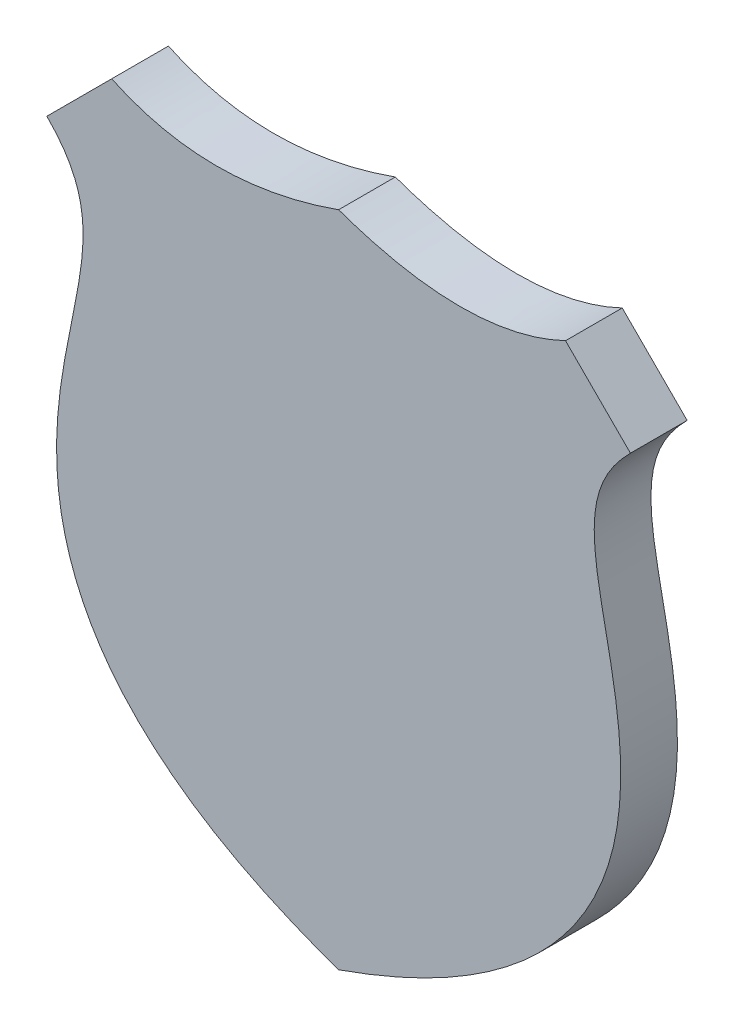
ISO-10303-21;
HEADER;
FILE_DESCRIPTION(('STEP AP214'),'2;1');
FILE_NAME('part.step','',(''),(''),'','','');
FILE_SCHEMA(('AUTOMOTIVE_DESIGN { 1 0 10303 214 1 1 1 1 }'));
ENDSEC;
DATA;
#1=APPLICATION_CONTEXT('core data for automotive mechanical design processes');
#2=APPLICATION_PROTOCOL_DEFINITION('international standard','automotive_design',2000,#1);
#3=PRODUCT_CONTEXT('',#1,'mechanical');
#4=PRODUCT('Part','Part','',(#3));
#5=PRODUCT_RELATED_PRODUCT_CATEGORY('part','',(#4));
#6=PRODUCT_DEFINITION_FORMATION('','',#4);
#7=PRODUCT_DEFINITION_CONTEXT('part definition',#1,'design');
#8=PRODUCT_DEFINITION('design','',#6,#7);
#9=PRODUCT_DEFINITION_SHAPE('','',#8);
#10=(LENGTH_UNIT() NAMED_UNIT(*) SI_UNIT(.MILLI.,.METRE.));
#11=(NAMED_UNIT(*) PLANE_ANGLE_UNIT() SI_UNIT($,.RADIAN.));
#12=(NAMED_UNIT(*) SI_UNIT($,.STERADIAN.) SOLID_ANGLE_UNIT());
#13=UNCERTAINTY_MEASURE_WITH_UNIT(LENGTH_MEASURE(1.E-05),#10,'distance_accuracy_value','');
#14=(GEOMETRIC_REPRESENTATION_CONTEXT(3) GLOBAL_UNCERTAINTY_ASSIGNED_CONTEXT((#13)) GLOBAL_UNIT_ASSIGNED_CONTEXT((#10,
#11,#12)) REPRESENTATION_CONTEXT('',''));
#15=CARTESIAN_POINT('',(0.,0.,0.));
#16=DIRECTION('',(0.,0.,1.));
#17=DIRECTION('',(1.,0.,0.));
#18=AXIS2_PLACEMENT_3D('',#15,#16,#17);
#19=CARTESIAN_POINT('',(25.4,0.,6.35));
#20=CARTESIAN_POINT('',(14.5422885866351,-5.18026315789474,6.35));
#21=CARTESIAN_POINT('',(0.,0.,6.35));
#22=B_SPLINE_CURVE_WITH_KNOTS('',2,(#19,#20,#21),.UNSPECIFIED.,.F.,.F.,(3,3),(0.,1.),.UNSPECIFIED.);
#23=DIRECTION('',(0.,0.,-1.));
#24=VECTOR('',#23,1.);
#25=SURFACE_OF_LINEAR_EXTRUSION('',#22,#24);
#26=CARTESIAN_POINT('',(25.4,0.,0.));
#27=CARTESIAN_POINT('',(14.5422885866351,-5.18026315789474,0.));
#28=CARTESIAN_POINT('',(0.,0.,0.));
#29=B_SPLINE_CURVE_WITH_KNOTS('',2,(#26,#27,#28),.UNSPECIFIED.,.F.,.F.,(3,3),(0.,1.),.UNSPECIFIED.);
#30=CARTESIAN_POINT('',(25.4,0.,0.));
#31=VERTEX_POINT('',#30);
#32=CARTESIAN_POINT('',(0.,0.,0.));
#33=VERTEX_POINT('',#32);
#34=EDGE_CURVE('E173',#31,#33,#29,.T.);
#35=ORIENTED_EDGE('',*,*,#34,.T.);
#36=DIRECTION('',(0.,0.,-1.));
#37=VECTOR('',#36,1.);
#38=CARTESIAN_POINT('',(0.,0.,6.35));
#39=LINE('',#38,#37);
#40=CARTESIAN_POINT('',(0.,0.,6.35));
#41=VERTEX_POINT('',#40);
#42=EDGE_CURVE('E11',#41,#33,#39,.T.);
#43=ORIENTED_EDGE('',*,*,#42,.F.);
#44=CARTESIAN_POINT('',(25.4,0.,6.35));
#45=VERTEX_POINT('',#44);
#46=EDGE_CURVE('E145',#45,#41,#22,.T.);
#47=ORIENTED_EDGE('',*,*,#46,.F.);
#48=DIRECTION('',(0.,0.,-1.));
#49=VECTOR('',#48,1.);
#50=CARTESIAN_POINT('',(25.4,0.,6.35));
#51=LINE('',#50,#49);
#52=EDGE_CURVE('E115',#45,#31,#51,.T.);
#53=ORIENTED_EDGE('',*,*,#52,.T.);
#54=EDGE_LOOP('',(#35,#43,#47,#53));
#55=FACE_BOUND('',#54,.T.);
#56=ADVANCED_FACE('F34',(#55),#25,.F.);
#57=CARTESIAN_POINT('',(0.,0.,6.35));
#58=CARTESIAN_POINT('',(-14.5422885866351,-5.18026315789474,6.35));
#59=CARTESIAN_POINT('',(-25.4,0.,6.35));
#60=B_SPLINE_CURVE_WITH_KNOTS('',2,(#57,#58,#59),.UNSPECIFIED.,.F.,.F.,(3,3),(0.,1.),.UNSPECIFIED.);
#61=DIRECTION('',(0.,0.,-1.));
#62=VECTOR('',#61,1.);
#63=SURFACE_OF_LINEAR_EXTRUSION('',#60,#62);
#64=CARTESIAN_POINT('',(0.,0.,0.));
#65=CARTESIAN_POINT('',(-14.5422885866351,-5.18026315789474,0.));
#66=CARTESIAN_POINT('',(-25.4,0.,0.));
#67=B_SPLINE_CURVE_WITH_KNOTS('',2,(#64,#65,#66),.UNSPECIFIED.,.F.,.F.,(3,3),(0.,1.),.UNSPECIFIED.);
#68=CARTESIAN_POINT('',(-25.4,0.,0.));
#69=VERTEX_POINT('',#68);
#70=EDGE_CURVE('E171',#33,#69,#67,.T.);
#71=ORIENTED_EDGE('',*,*,#70,.T.);
#72=DIRECTION('',(0.,0.,-1.));
#73=VECTOR('',#72,1.);
#74=CARTESIAN_POINT('',(-25.4,0.,6.35));
#75=LINE('',#74,#73);
#76=CARTESIAN_POINT('',(-25.4,0.,6.35));
#77=VERTEX_POINT('',#76);
#78=EDGE_CURVE('E43',#77,#69,#75,.T.);
#79=ORIENTED_EDGE('',*,*,#78,.F.);
#80=EDGE_CURVE('E88',#41,#77,#60,.T.);
#81=ORIENTED_EDGE('',*,*,#80,.F.);
#82=ORIENTED_EDGE('',*,*,#42,.T.);
#83=EDGE_LOOP('',(#71,#79,#81,#82));
#84=FACE_BOUND('',#83,.T.);
#85=ADVANCED_FACE('F138',(#84),#63,.F.);
#86=CARTESIAN_POINT('',(-25.4,0.,6.35));
#87=DIRECTION('',(0.707106781186548,-0.707106781186548,0.));
#88=DIRECTION('',(0.707106781186548,0.707106781186548,0.));
#89=AXIS2_PLACEMENT_3D('',#86,#87,#88);
#90=PLANE('',#89);
#91=DIRECTION('',(-0.707106781186548,-0.707106781186548,0.));
#92=VECTOR('',#91,1.);
#93=CARTESIAN_POINT('',(-25.4,0.,0.));
#94=LINE('',#93,#92);
#95=CARTESIAN_POINT('',(-32.6690789473684,-7.26907894736839,0.));
#96=VERTEX_POINT('',#95);
#97=EDGE_CURVE('E167',#69,#96,#94,.T.);
#98=ORIENTED_EDGE('',*,*,#97,.T.);
#99=DIRECTION('',(0.,0.,-1.));
#100=VECTOR('',#99,1.);
#101=CARTESIAN_POINT('',(-32.6690789473684,-7.26907894736839,6.35));
#102=LINE('',#101,#100);
#103=CARTESIAN_POINT('',(-32.6690789473684,-7.26907894736839,6.35));
#104=VERTEX_POINT('',#103);
#105=EDGE_CURVE('E110',#104,#96,#102,.T.);
#106=ORIENTED_EDGE('',*,*,#105,.F.);
#107=DIRECTION('',(-0.707106781186548,-0.707106781186548,0.));
#108=VECTOR('',#107,1.);
#109=CARTESIAN_POINT('',(-25.4,0.,6.35));
#110=LINE('',#109,#108);
#111=EDGE_CURVE('E101',#77,#104,#110,.T.);
#112=ORIENTED_EDGE('',*,*,#111,.F.);
#113=ORIENTED_EDGE('',*,*,#78,.T.);
#114=EDGE_LOOP('',(#98,#106,#112,#113));
#115=FACE_BOUND('',#114,.T.);
#116=ADVANCED_FACE('F136',(#115),#90,.F.);
#117=CARTESIAN_POINT('',(-32.6690789473684,-7.26907894736839,6.35));
#118=CARTESIAN_POINT('',(-22.6406978119456,-17.2974600827912,6.35));
#119=CARTESIAN_POINT('',(-30.5761324659965,-26.2355263157895,6.35));
#120=CARTESIAN_POINT('',(-43.9445535186281,-49.9644736842105,6.35));
#121=CARTESIAN_POINT('',(-23.8919219396807,-65.3381578947369,6.35));
#122=CARTESIAN_POINT('',(0.,-73.6934210526316,6.35));
#123=B_SPLINE_CURVE_WITH_KNOTS('',5,(#117,#118,#119,#120,#121,#122),.UNSPECIFIED.,.F.,.F.,(6,6),
(0.,1.),.UNSPECIFIED.);
#124=DIRECTION('',(0.,0.,-1.));
#125=VECTOR('',#124,1.);
#126=SURFACE_OF_LINEAR_EXTRUSION('',#123,#125);
#127=CARTESIAN_POINT('',(-32.6690789473684,-7.26907894736839,0.));
#128=CARTESIAN_POINT('',(-22.6406978119456,-17.2974600827912,0.));
#129=CARTESIAN_POINT('',(-30.5761324659965,-26.2355263157895,0.));
#130=CARTESIAN_POINT('',(-43.9445535186281,-49.9644736842105,0.));
#131=CARTESIAN_POINT('',(-23.8919219396807,-65.3381578947369,0.));
#132=CARTESIAN_POINT('',(0.,-73.6934210526316,0.));
#133=B_SPLINE_CURVE_WITH_KNOTS('',5,(#127,#128,#129,#130,#131,#132),.UNSPECIFIED.,.F.,.F.,(6,6),
(0.,1.),.UNSPECIFIED.);
#134=CARTESIAN_POINT('',(0.,-73.6934210526316,0.));
#135=VERTEX_POINT('',#134);
#136=EDGE_CURVE('E109',#96,#135,#133,.T.);
#137=ORIENTED_EDGE('',*,*,#136,.T.);
#138=DIRECTION('',(0.,0.,-1.));
#139=VECTOR('',#138,1.);
#140=CARTESIAN_POINT('',(0.,-73.6934210526316,6.35));
#141=LINE('',#140,#139);
#142=CARTESIAN_POINT('',(0.,-73.6934210526316,6.35));
#143=VERTEX_POINT('',#142);
#144=EDGE_CURVE('E106',#143,#135,#141,.T.);
#145=ORIENTED_EDGE('',*,*,#144,.F.);
#146=EDGE_CURVE('E95',#104,#143,#123,.T.);
#147=ORIENTED_EDGE('',*,*,#146,.F.);
#148=ORIENTED_EDGE('',*,*,#105,.T.);
#149=EDGE_LOOP('',(#137,#145,#147,#148));
#150=FACE_BOUND('',#149,.T.);
#151=ADVANCED_FACE('F107',(#150),#126,.F.);
#152=CARTESIAN_POINT('',(0.,-73.6934210526316,6.35));
#153=CARTESIAN_POINT('',(23.8919219396807,-65.3381578947369,6.35));
#154=CARTESIAN_POINT('',(43.9445535186281,-49.9644736842105,6.35));
#155=CARTESIAN_POINT('',(30.5761324659965,-26.2355263157895,6.35));
#156=CARTESIAN_POINT('',(22.6406978119456,-17.2974600827912,6.35));
#157=CARTESIAN_POINT('',(32.6690789473684,-7.26907894736839,6.35));
#158=B_SPLINE_CURVE_WITH_KNOTS('',5,(#152,#153,#154,#155,#156,#157),.UNSPECIFIED.,.F.,.F.,(6,6),
(0.,1.),.UNSPECIFIED.);
#159=DIRECTION('',(0.,0.,-1.));
#160=VECTOR('',#159,1.);
#161=SURFACE_OF_LINEAR_EXTRUSION('',#158,#160);
#162=CARTESIAN_POINT('',(0.,-73.6934210526316,0.));
#163=CARTESIAN_POINT('',(23.8919219396807,-65.3381578947369,0.));
#164=CARTESIAN_POINT('',(43.9445535186281,-49.9644736842105,0.));
#165=CARTESIAN_POINT('',(30.5761324659965,-26.2355263157895,0.));
#166=CARTESIAN_POINT('',(22.6406978119456,-17.2974600827912,0.));
#167=CARTESIAN_POINT('',(32.6690789473684,-7.26907894736839,0.));
#168=B_SPLINE_CURVE_WITH_KNOTS('',5,(#162,#163,#164,#165,#166,#167),.UNSPECIFIED.,.F.,.F.,(6,6),
(0.,1.),.UNSPECIFIED.);
#169=CARTESIAN_POINT('',(32.6690789473684,-7.26907894736839,0.));
#170=VERTEX_POINT('',#169);
#171=EDGE_CURVE('E74',#135,#170,#168,.T.);
#172=ORIENTED_EDGE('',*,*,#171,.T.);
#173=DIRECTION('',(0.,0.,-1.));
#174=VECTOR('',#173,1.);
#175=CARTESIAN_POINT('',(32.6690789473684,-7.26907894736839,6.35));
#176=LINE('',#175,#174);
#177=CARTESIAN_POINT('',(32.6690789473684,-7.26907894736839,6.35));
#178=VERTEX_POINT('',#177);
#179=EDGE_CURVE('E111',#178,#170,#176,.T.);
#180=ORIENTED_EDGE('',*,*,#179,.F.);
#181=EDGE_CURVE('E99',#143,#178,#158,.T.);
#182=ORIENTED_EDGE('',*,*,#181,.F.);
#183=ORIENTED_EDGE('',*,*,#144,.T.);
#184=EDGE_LOOP('',(#172,#180,#182,#183));
#185=FACE_BOUND('',#184,.T.);
#186=ADVANCED_FACE('F113',(#185),#161,.F.);
#187=CARTESIAN_POINT('',(25.4,0.,6.35));
#188=DIRECTION('',(-0.707106781186548,-0.707106781186548,0.));
#189=DIRECTION('',(0.707106781186548,-0.707106781186548,0.));
#190=AXIS2_PLACEMENT_3D('',#187,#188,#189);
#191=PLANE('',#190);
#192=DIRECTION('',(-0.707106781186548,0.707106781186548,0.));
#193=VECTOR('',#192,1.);
#194=CARTESIAN_POINT('',(25.4,0.,0.));
#195=LINE('',#194,#193);
#196=EDGE_CURVE('E80',#170,#31,#195,.T.);
#197=ORIENTED_EDGE('',*,*,#196,.T.);
#198=ORIENTED_EDGE('',*,*,#52,.F.);
#199=DIRECTION('',(-0.707106781186548,0.707106781186548,0.));
#200=VECTOR('',#199,1.);
#201=CARTESIAN_POINT('',(25.4,0.,6.35));
#202=LINE('',#201,#200);
#203=EDGE_CURVE('E51',#178,#45,#202,.T.);
#204=ORIENTED_EDGE('',*,*,#203,.F.);
#205=ORIENTED_EDGE('',*,*,#179,.T.);
#206=EDGE_LOOP('',(#197,#198,#204,#205));
#207=FACE_BOUND('',#206,.T.);
#208=ADVANCED_FACE('F132',(#207),#191,.F.);
#209=CARTESIAN_POINT('',(13.6211442933176,-2.59013157894737,6.35));
#210=DIRECTION('',(0.,0.,1.));
#211=DIRECTION('',(1.,0.,0.));
#212=AXIS2_PLACEMENT_3D('',#209,#210,#211);
#213=PLANE('',#212);
#214=ORIENTED_EDGE('',*,*,#46,.T.);
#215=ORIENTED_EDGE('',*,*,#80,.T.);
#216=ORIENTED_EDGE('',*,*,#111,.T.);
#217=ORIENTED_EDGE('',*,*,#146,.T.);
#218=ORIENTED_EDGE('',*,*,#181,.T.);
#219=ORIENTED_EDGE('',*,*,#203,.T.);
#220=EDGE_LOOP('',(#214,#215,#216,#217,#218,#219));
#221=FACE_BOUND('',#220,.T.);
#222=ADVANCED_FACE('F97',(#221),#213,.T.);
#223=CARTESIAN_POINT('',(13.6211442933176,-2.59013157894737,0.));
#224=DIRECTION('',(0.,0.,1.));
#225=DIRECTION('',(1.,0.,0.));
#226=AXIS2_PLACEMENT_3D('',#223,#224,#225);
#227=PLANE('',#226);
#228=ORIENTED_EDGE('',*,*,#34,.F.);
#229=ORIENTED_EDGE('',*,*,#196,.F.);
#230=ORIENTED_EDGE('',*,*,#171,.F.);
#231=ORIENTED_EDGE('',*,*,#136,.F.);
#232=ORIENTED_EDGE('',*,*,#97,.F.);
#233=ORIENTED_EDGE('',*,*,#70,.F.);
#234=EDGE_LOOP('',(#228,#229,#230,#231,#232,#233));
#235=FACE_BOUND('',#234,.T.);
#236=ADVANCED_FACE('F170',(#235),#227,.F.);
#237=CLOSED_SHELL('',(#56,#85,#116,#151,#186,#208,#222,#236));
#238=MANIFOLD_SOLID_BREP('B2',#237);
#239=ADVANCED_BREP_SHAPE_REPRESENTATION('',(#18,#238),#14);
#240=SHAPE_DEFINITION_REPRESENTATION(#9,#239);
ENDSEC;
END-ISO-10303-21;
